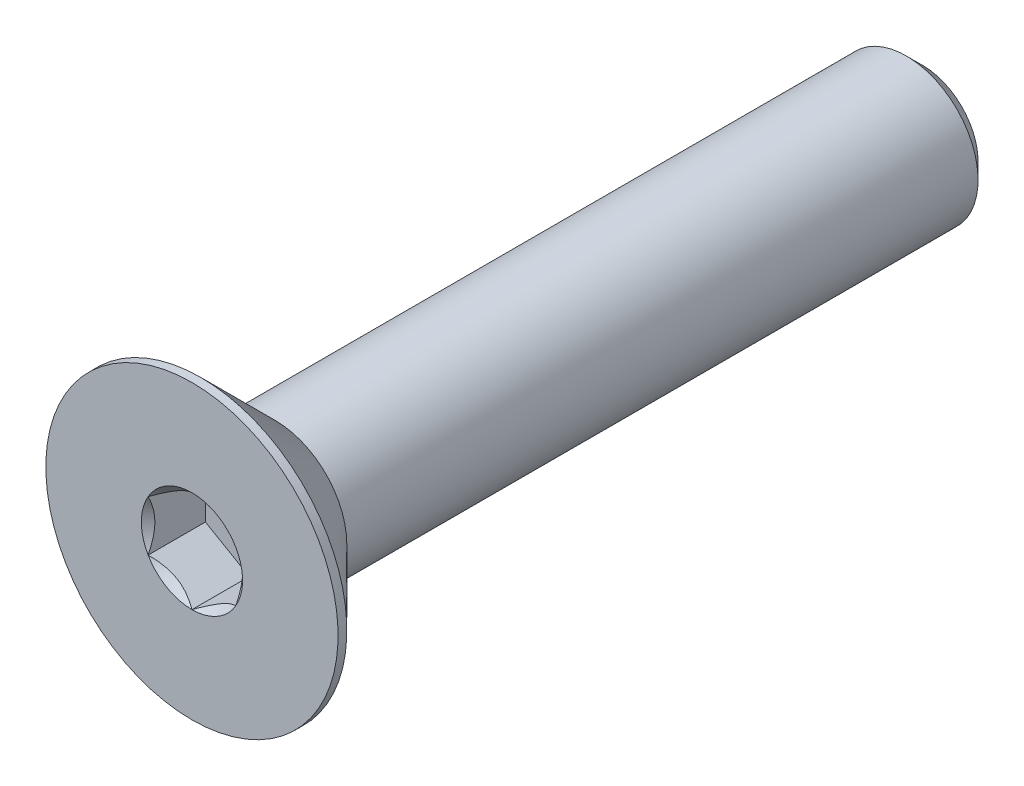
ISO-10303-21;
HEADER;
FILE_DESCRIPTION(('STEP AP214'),'2;1');
FILE_NAME('part.step','',(''),(''),'','','');
FILE_SCHEMA(('AUTOMOTIVE_DESIGN { 1 0 10303 214 1 1 1 1 }'));
ENDSEC;
DATA;
#1=APPLICATION_CONTEXT('core data for automotive mechanical design processes');
#2=APPLICATION_PROTOCOL_DEFINITION('international standard','automotive_design',2000,#1);
#3=PRODUCT_CONTEXT('',#1,'mechanical');
#4=PRODUCT('Part','Part','',(#3));
#5=PRODUCT_RELATED_PRODUCT_CATEGORY('part','',(#4));
#6=PRODUCT_DEFINITION_FORMATION('','',#4);
#7=PRODUCT_DEFINITION_CONTEXT('part definition',#1,'design');
#8=PRODUCT_DEFINITION('design','',#6,#7);
#9=PRODUCT_DEFINITION_SHAPE('','',#8);
#10=(LENGTH_UNIT() NAMED_UNIT(*) SI_UNIT(.MILLI.,.METRE.));
#11=(NAMED_UNIT(*) PLANE_ANGLE_UNIT() SI_UNIT($,.RADIAN.));
#12=(NAMED_UNIT(*) SI_UNIT($,.STERADIAN.) SOLID_ANGLE_UNIT());
#13=UNCERTAINTY_MEASURE_WITH_UNIT(LENGTH_MEASURE(1.E-05),#10,'distance_accuracy_value','');
#14=(GEOMETRIC_REPRESENTATION_CONTEXT(3) GLOBAL_UNCERTAINTY_ASSIGNED_CONTEXT((#13)) GLOBAL_UNIT_ASSIGNED_CONTEXT((#10,
#11,#12)) REPRESENTATION_CONTEXT('',''));
#15=CARTESIAN_POINT('',(0.,0.,0.));
#16=DIRECTION('',(0.,0.,1.));
#17=DIRECTION('',(1.,0.,0.));
#18=AXIS2_PLACEMENT_3D('',#15,#16,#17);
#19=CARTESIAN_POINT('',(0.,-1.73205080756888,-1.96));
#20=DIRECTION('',(0.5,-0.866025403784439,0.));
#21=DIRECTION('',(0.,0.,-1.));
#22=AXIS2_PLACEMENT_3D('',#19,#20,#21);
#23=PLANE('',#22);
#24=DIRECTION('',(0.,0.,1.));
#25=VECTOR('',#24,1.);
#26=CARTESIAN_POINT('',(0.,-1.73205080756888,-1.96));
#27=LINE('',#26,#25);
#28=CARTESIAN_POINT('',(0.,-1.73205080756888,-1.96));
#29=VERTEX_POINT('',#28);
#30=CARTESIAN_POINT('',(0.,-1.73205080756888,0.));
#31=VERTEX_POINT('',#30);
#32=EDGE_CURVE('E11',#29,#31,#27,.T.);
#33=ORIENTED_EDGE('',*,*,#32,.T.);
#34=CARTESIAN_POINT('',(0.,-1.73205080756888,0.));
#35=CARTESIAN_POINT('',(0.749999999999999,-1.29903810567666,-0.433012701892219));
#36=CARTESIAN_POINT('',(1.5,-0.86602540378444,0.));
#37=(BOUNDED_CURVE() B_SPLINE_CURVE(2,(#34,#35,#36),.UNSPECIFIED.,.F.,
.F.) B_SPLINE_CURVE_WITH_KNOTS((3,3),(-0.388312804292311,-0.130611113351457),
.UNSPECIFIED.) CURVE() GEOMETRIC_REPRESENTATION_ITEM() RATIONAL_B_SPLINE_CURVE((1.3094010767585,
1.51196612828742,1.3094010767585)) REPRESENTATION_ITEM(''));
#38=CARTESIAN_POINT('',(1.5,-0.86602540378444,0.));
#39=VERTEX_POINT('',#38);
#40=EDGE_CURVE('E112',#31,#39,#37,.T.);
#41=ORIENTED_EDGE('',*,*,#40,.T.);
#42=DIRECTION('',(0.,0.,1.));
#43=VECTOR('',#42,1.);
#44=CARTESIAN_POINT('',(1.5,-0.866025403784439,-1.96));
#45=LINE('',#44,#43);
#46=CARTESIAN_POINT('',(1.5,-0.866025403784439,-1.96));
#47=VERTEX_POINT('',#46);
#48=EDGE_CURVE('E181',#47,#39,#45,.T.);
#49=ORIENTED_EDGE('',*,*,#48,.F.);
#50=DIRECTION('',(0.866025403784439,0.5,0.));
#51=VECTOR('',#50,1.);
#52=CARTESIAN_POINT('',(0.,-1.73205080756888,-1.96));
#53=LINE('',#52,#51);
#54=EDGE_CURVE('E173',#29,#47,#53,.T.);
#55=ORIENTED_EDGE('',*,*,#54,.F.);
#56=EDGE_LOOP('',(#33,#41,#49,#55));
#57=FACE_BOUND('',#56,.T.);
#58=ADVANCED_FACE('F17',(#57),#23,.F.);
#59=CARTESIAN_POINT('',(-1.5,-0.866025403784438,-1.96));
#60=DIRECTION('',(-0.5,-0.866025403784439,0.));
#61=DIRECTION('',(-0.866025403784439,0.5,0.));
#62=AXIS2_PLACEMENT_3D('',#59,#60,#61);
#63=PLANE('',#62);
#64=DIRECTION('',(0.,0.,1.));
#65=VECTOR('',#64,1.);
#66=CARTESIAN_POINT('',(-1.5,-0.866025403784438,-1.96));
#67=LINE('',#66,#65);
#68=CARTESIAN_POINT('',(-1.5,-0.866025403784438,-1.96));
#69=VERTEX_POINT('',#68);
#70=CARTESIAN_POINT('',(-1.5,-0.866025403784438,0.));
#71=VERTEX_POINT('',#70);
#72=EDGE_CURVE('E27',#69,#71,#67,.T.);
#73=ORIENTED_EDGE('',*,*,#72,.T.);
#74=CARTESIAN_POINT('',(-1.5,-0.86602540378444,0.));
#75=CARTESIAN_POINT('',(-0.749999999999999,-1.29903810567666,-0.433012701892218));
#76=CARTESIAN_POINT('',(0.,-1.73205080756888,0.));
#77=(BOUNDED_CURVE() B_SPLINE_CURVE(2,(#74,#75,#76),.UNSPECIFIED.,.F.,
.F.) B_SPLINE_CURVE_WITH_KNOTS((3,3),(-0.388312804292311,-0.130611113351457),
.UNSPECIFIED.) CURVE() GEOMETRIC_REPRESENTATION_ITEM() RATIONAL_B_SPLINE_CURVE((1.3094010767585,
1.51196612828742,1.3094010767585)) REPRESENTATION_ITEM(''));
#78=EDGE_CURVE('E99',#71,#31,#77,.T.);
#79=ORIENTED_EDGE('',*,*,#78,.T.);
#80=ORIENTED_EDGE('',*,*,#32,.F.);
#81=DIRECTION('',(0.866025403784439,-0.5,0.));
#82=VECTOR('',#81,1.);
#83=CARTESIAN_POINT('',(-1.5,-0.866025403784438,-1.96));
#84=LINE('',#83,#82);
#85=EDGE_CURVE('E102',#69,#29,#84,.T.);
#86=ORIENTED_EDGE('',*,*,#85,.F.);
#87=EDGE_LOOP('',(#73,#79,#80,#86));
#88=FACE_BOUND('',#87,.T.);
#89=ADVANCED_FACE('F98',(#88),#63,.F.);
#90=CARTESIAN_POINT('',(-1.5,0.866025403784439,-1.96));
#91=DIRECTION('',(-1.,0.,0.));
#92=DIRECTION('',(0.,0.,1.));
#93=AXIS2_PLACEMENT_3D('',#90,#91,#92);
#94=PLANE('',#93);
#95=DIRECTION('',(0.,0.,1.));
#96=VECTOR('',#95,1.);
#97=CARTESIAN_POINT('',(-1.5,0.866025403784439,-1.96));
#98=LINE('',#97,#96);
#99=CARTESIAN_POINT('',(-1.5,0.866025403784439,-1.96));
#100=VERTEX_POINT('',#99);
#101=CARTESIAN_POINT('',(-1.5,0.86602540378444,0.));
#102=VERTEX_POINT('',#101);
#103=EDGE_CURVE('E52',#100,#102,#98,.T.);
#104=ORIENTED_EDGE('',*,*,#103,.T.);
#105=CARTESIAN_POINT('',(-1.5,0.866025403784437,0.));
#106=CARTESIAN_POINT('',(-1.5,0.,-0.433012701892218));
#107=CARTESIAN_POINT('',(-1.5,-0.866025403784438,0.));
#108=(BOUNDED_CURVE() B_SPLINE_CURVE(2,(#105,#106,#107),.UNSPECIFIED.,.F.,
.F.) B_SPLINE_CURVE_WITH_KNOTS((3,3),(-0.388312804292311,-0.130611113351457),
.UNSPECIFIED.) CURVE() GEOMETRIC_REPRESENTATION_ITEM() RATIONAL_B_SPLINE_CURVE((1.3094010767585,
1.51196612828742,1.3094010767585)) REPRESENTATION_ITEM(''));
#109=EDGE_CURVE('E113',#102,#71,#108,.T.);
#110=ORIENTED_EDGE('',*,*,#109,.T.);
#111=ORIENTED_EDGE('',*,*,#72,.F.);
#112=DIRECTION('',(0.,-1.,0.));
#113=VECTOR('',#112,1.);
#114=CARTESIAN_POINT('',(-1.5,0.866025403784439,-1.96));
#115=LINE('',#114,#113);
#116=EDGE_CURVE('E21',#100,#69,#115,.T.);
#117=ORIENTED_EDGE('',*,*,#116,.F.);
#118=EDGE_LOOP('',(#104,#110,#111,#117));
#119=FACE_BOUND('',#118,.T.);
#120=ADVANCED_FACE('F117',(#119),#94,.F.);
#121=CARTESIAN_POINT('',(0.,1.73205080756888,-1.96));
#122=DIRECTION('',(-0.5,0.866025403784439,0.));
#123=DIRECTION('',(0.,0.,1.));
#124=AXIS2_PLACEMENT_3D('',#121,#122,#123);
#125=PLANE('',#124);
#126=DIRECTION('',(0.,0.,1.));
#127=VECTOR('',#126,1.);
#128=CARTESIAN_POINT('',(0.,1.73205080756888,-1.96));
#129=LINE('',#128,#127);
#130=CARTESIAN_POINT('',(0.,1.73205080756888,-1.96));
#131=VERTEX_POINT('',#130);
#132=CARTESIAN_POINT('',(0.,1.73205080756888,0.));
#133=VERTEX_POINT('',#132);
#134=EDGE_CURVE('E180',#131,#133,#129,.T.);
#135=ORIENTED_EDGE('',*,*,#134,.T.);
#136=CARTESIAN_POINT('',(0.,1.73205080756888,0.));
#137=CARTESIAN_POINT('',(-0.75,1.29903810567666,-0.433012701892217));
#138=CARTESIAN_POINT('',(-1.5,0.86602540378444,0.));
#139=(BOUNDED_CURVE() B_SPLINE_CURVE(2,(#136,#137,#138),.UNSPECIFIED.,.F.,
.F.) B_SPLINE_CURVE_WITH_KNOTS((3,3),(-0.388312804292311,-0.130611113351457),
.UNSPECIFIED.) CURVE() GEOMETRIC_REPRESENTATION_ITEM() RATIONAL_B_SPLINE_CURVE((1.3094010767585,
1.51196612828741,1.3094010767585)) REPRESENTATION_ITEM(''));
#140=EDGE_CURVE('E120',#133,#102,#139,.T.);
#141=ORIENTED_EDGE('',*,*,#140,.T.);
#142=ORIENTED_EDGE('',*,*,#103,.F.);
#143=DIRECTION('',(-0.866025403784439,-0.5,0.));
#144=VECTOR('',#143,1.);
#145=CARTESIAN_POINT('',(0.,1.73205080756888,-1.96));
#146=LINE('',#145,#144);
#147=EDGE_CURVE('E161',#131,#100,#146,.T.);
#148=ORIENTED_EDGE('',*,*,#147,.F.);
#149=EDGE_LOOP('',(#135,#141,#142,#148));
#150=FACE_BOUND('',#149,.T.);
#151=ADVANCED_FACE('F348',(#150),#125,.F.);
#152=CARTESIAN_POINT('',(1.5,0.866025403784439,-1.96));
#153=DIRECTION('',(0.5,0.866025403784439,0.));
#154=DIRECTION('',(0.,0.,-1.));
#155=AXIS2_PLACEMENT_3D('',#152,#153,#154);
#156=PLANE('',#155);
#157=DIRECTION('',(0.,0.,1.));
#158=VECTOR('',#157,1.);
#159=CARTESIAN_POINT('',(1.5,0.866025403784439,-1.96));
#160=LINE('',#159,#158);
#161=CARTESIAN_POINT('',(1.5,0.866025403784439,-1.96));
#162=VERTEX_POINT('',#161);
#163=CARTESIAN_POINT('',(1.5,0.866025403784439,0.));
#164=VERTEX_POINT('',#163);
#165=EDGE_CURVE('E177',#162,#164,#160,.T.);
#166=ORIENTED_EDGE('',*,*,#165,.T.);
#167=CARTESIAN_POINT('',(1.5,0.86602540378444,0.));
#168=CARTESIAN_POINT('',(0.749999999999999,1.29903810567666,-0.433012701892218));
#169=CARTESIAN_POINT('',(0.,1.73205080756888,0.));
#170=(BOUNDED_CURVE() B_SPLINE_CURVE(2,(#167,#168,#169),.UNSPECIFIED.,.F.,
.F.) B_SPLINE_CURVE_WITH_KNOTS((3,3),(-0.388312804292311,-0.130611113351457),
.UNSPECIFIED.) CURVE() GEOMETRIC_REPRESENTATION_ITEM() RATIONAL_B_SPLINE_CURVE((1.3094010767585,
1.51196612828742,1.3094010767585)) REPRESENTATION_ITEM(''));
#171=EDGE_CURVE('E192',#164,#133,#170,.T.);
#172=ORIENTED_EDGE('',*,*,#171,.T.);
#173=ORIENTED_EDGE('',*,*,#134,.F.);
#174=DIRECTION('',(-0.866025403784439,0.5,0.));
#175=VECTOR('',#174,1.);
#176=CARTESIAN_POINT('',(1.5,0.866025403784439,-1.96));
#177=LINE('',#176,#175);
#178=EDGE_CURVE('E157',#162,#131,#177,.T.);
#179=ORIENTED_EDGE('',*,*,#178,.F.);
#180=EDGE_LOOP('',(#166,#172,#173,#179));
#181=FACE_BOUND('',#180,.T.);
#182=ADVANCED_FACE('F350',(#181),#156,.F.);
#183=CARTESIAN_POINT('',(1.5,-0.866025403784439,-1.96));
#184=DIRECTION('',(1.,0.,0.));
#185=DIRECTION('',(0.,-1.,0.));
#186=AXIS2_PLACEMENT_3D('',#183,#184,#185);
#187=PLANE('',#186);
#188=ORIENTED_EDGE('',*,*,#48,.T.);
#189=CARTESIAN_POINT('',(1.5,-0.866025403784438,0.));
#190=CARTESIAN_POINT('',(1.5,0.,-0.433012701892218));
#191=CARTESIAN_POINT('',(1.5,0.86602540378444,0.));
#192=(BOUNDED_CURVE() B_SPLINE_CURVE(2,(#189,#190,#191),.UNSPECIFIED.,.F.,
.F.) B_SPLINE_CURVE_WITH_KNOTS((3,3),(-0.388312804292311,-0.130611113351457),
.UNSPECIFIED.) CURVE() GEOMETRIC_REPRESENTATION_ITEM() RATIONAL_B_SPLINE_CURVE((1.3094010767585,
1.51196612828742,1.3094010767585)) REPRESENTATION_ITEM(''));
#193=EDGE_CURVE('E169',#39,#164,#192,.T.);
#194=ORIENTED_EDGE('',*,*,#193,.T.);
#195=ORIENTED_EDGE('',*,*,#165,.F.);
#196=DIRECTION('',(0.,1.,0.));
#197=VECTOR('',#196,1.);
#198=CARTESIAN_POINT('',(1.5,-0.866025403784439,-1.96));
#199=LINE('',#198,#197);
#200=EDGE_CURVE('E162',#47,#162,#199,.T.);
#201=ORIENTED_EDGE('',*,*,#200,.F.);
#202=EDGE_LOOP('',(#188,#194,#195,#201));
#203=FACE_BOUND('',#202,.T.);
#204=ADVANCED_FACE('F362',(#203),#187,.F.);
#205=CARTESIAN_POINT('',(1.5,-0.866025403784438,-1.96));
#206=DIRECTION('',(0.,0.,1.));
#207=DIRECTION('',(1.,0.,0.));
#208=AXIS2_PLACEMENT_3D('',#205,#206,#207);
#209=PLANE('',#208);
#210=ORIENTED_EDGE('',*,*,#54,.T.);
#211=ORIENTED_EDGE('',*,*,#200,.T.);
#212=ORIENTED_EDGE('',*,*,#178,.T.);
#213=ORIENTED_EDGE('',*,*,#147,.T.);
#214=ORIENTED_EDGE('',*,*,#116,.T.);
#215=ORIENTED_EDGE('',*,*,#85,.T.);
#216=EDGE_LOOP('',(#210,#211,#212,#213,#214,#215));
#217=FACE_BOUND('',#216,.T.);
#218=ADVANCED_FACE('F338',(#217),#209,.T.);
#219=CARTESIAN_POINT('',(0.,0.,0.));
#220=DIRECTION('',(0.,0.,1.));
#221=DIRECTION('',(1.,0.,0.));
#222=AXIS2_PLACEMENT_3D('',#219,#220,#221);
#223=CONICAL_SURFACE('',#222,1.73205080756888,0.78539816339745);
#224=CARTESIAN_POINT('',(0.,0.,0.));
#225=DIRECTION('',(0.,0.,1.));
#226=DIRECTION('',(1.,0.,0.));
#227=AXIS2_PLACEMENT_3D('',#224,#225,#226);
#228=CIRCLE('',#227,1.73205080756888);
#229=EDGE_CURVE('E134',#31,#39,#228,.T.);
#230=ORIENTED_EDGE('',*,*,#229,.T.);
#231=ORIENTED_EDGE('',*,*,#40,.F.);
#232=EDGE_LOOP('',(#230,#231));
#233=FACE_BOUND('',#232,.T.);
#234=ADVANCED_FACE('F255',(#233),#223,.F.);
#235=CARTESIAN_POINT('',(0.,0.,0.));
#236=DIRECTION('',(0.,0.,1.));
#237=DIRECTION('',(1.,0.,0.));
#238=AXIS2_PLACEMENT_3D('',#235,#236,#237);
#239=CONICAL_SURFACE('',#238,1.73205080756888,0.78539816339745);
#240=CARTESIAN_POINT('',(0.,0.,0.));
#241=DIRECTION('',(0.,0.,1.));
#242=DIRECTION('',(1.,0.,0.));
#243=AXIS2_PLACEMENT_3D('',#240,#241,#242);
#244=CIRCLE('',#243,1.73205080756888);
#245=EDGE_CURVE('E109',#71,#31,#244,.T.);
#246=ORIENTED_EDGE('',*,*,#245,.T.);
#247=ORIENTED_EDGE('',*,*,#78,.F.);
#248=EDGE_LOOP('',(#246,#247));
#249=FACE_BOUND('',#248,.T.);
#250=ADVANCED_FACE('F107',(#249),#239,.F.);
#251=CARTESIAN_POINT('',(0.,0.,0.));
#252=DIRECTION('',(0.,0.,1.));
#253=DIRECTION('',(-1.,0.,0.));
#254=AXIS2_PLACEMENT_3D('',#251,#252,#253);
#255=CONICAL_SURFACE('',#254,1.73205080756888,0.78539816339745);
#256=CARTESIAN_POINT('',(0.,0.,0.));
#257=DIRECTION('',(0.,0.,1.));
#258=DIRECTION('',(1.,0.,0.));
#259=AXIS2_PLACEMENT_3D('',#256,#257,#258);
#260=CIRCLE('',#259,1.73205080756888);
#261=EDGE_CURVE('E123',#102,#71,#260,.T.);
#262=ORIENTED_EDGE('',*,*,#261,.T.);
#263=ORIENTED_EDGE('',*,*,#109,.F.);
#264=EDGE_LOOP('',(#262,#263));
#265=FACE_BOUND('',#264,.T.);
#266=ADVANCED_FACE('F124',(#265),#255,.F.);
#267=CARTESIAN_POINT('',(0.,0.,0.));
#268=DIRECTION('',(0.,0.,1.));
#269=DIRECTION('',(1.,0.,0.));
#270=AXIS2_PLACEMENT_3D('',#267,#268,#269);
#271=CONICAL_SURFACE('',#270,1.73205080756888,0.78539816339745);
#272=CARTESIAN_POINT('',(0.,0.,0.));
#273=DIRECTION('',(0.,0.,1.));
#274=DIRECTION('',(1.,0.,0.));
#275=AXIS2_PLACEMENT_3D('',#272,#273,#274);
#276=CIRCLE('',#275,1.73205080756888);
#277=EDGE_CURVE('E128',#133,#102,#276,.T.);
#278=ORIENTED_EDGE('',*,*,#277,.T.);
#279=ORIENTED_EDGE('',*,*,#140,.F.);
#280=EDGE_LOOP('',(#278,#279));
#281=FACE_BOUND('',#280,.T.);
#282=ADVANCED_FACE('F320',(#281),#271,.F.);
#283=CARTESIAN_POINT('',(0.,0.,0.));
#284=DIRECTION('',(0.,0.,1.));
#285=DIRECTION('',(1.,0.,0.));
#286=AXIS2_PLACEMENT_3D('',#283,#284,#285);
#287=CONICAL_SURFACE('',#286,1.73205080756888,0.78539816339745);
#288=CARTESIAN_POINT('',(0.,0.,0.));
#289=DIRECTION('',(0.,0.,1.));
#290=DIRECTION('',(1.,0.,0.));
#291=AXIS2_PLACEMENT_3D('',#288,#289,#290);
#292=CIRCLE('',#291,1.73205080756888);
#293=EDGE_CURVE('E188',#164,#133,#292,.T.);
#294=ORIENTED_EDGE('',*,*,#293,.T.);
#295=ORIENTED_EDGE('',*,*,#171,.F.);
#296=EDGE_LOOP('',(#294,#295));
#297=FACE_BOUND('',#296,.T.);
#298=ADVANCED_FACE('F312',(#297),#287,.F.);
#299=CARTESIAN_POINT('',(0.,-2.5,0.));
#300=DIRECTION('',(0.,0.,1.));
#301=DIRECTION('',(0.,-1.,0.));
#302=AXIS2_PLACEMENT_3D('',#299,#300,#301);
#303=PLANE('',#302);
#304=ORIENTED_EDGE('',*,*,#229,.F.);
#305=ORIENTED_EDGE('',*,*,#245,.F.);
#306=ORIENTED_EDGE('',*,*,#261,.F.);
#307=ORIENTED_EDGE('',*,*,#277,.F.);
#308=ORIENTED_EDGE('',*,*,#293,.F.);
#309=CARTESIAN_POINT('',(0.,0.,0.));
#310=DIRECTION('',(0.,0.,1.));
#311=DIRECTION('',(1.,0.,0.));
#312=AXIS2_PLACEMENT_3D('',#309,#310,#311);
#313=CIRCLE('',#312,1.73205080756888);
#314=EDGE_CURVE('E218',#39,#164,#313,.T.);
#315=ORIENTED_EDGE('',*,*,#314,.F.);
#316=EDGE_LOOP('',(#304,#305,#306,#307,#308,#315));
#317=FACE_BOUND('',#316,.T.);
#318=CARTESIAN_POINT('',(0.,0.,0.));
#319=DIRECTION('',(0.,0.,1.));
#320=DIRECTION('',(0.,-1.,0.));
#321=AXIS2_PLACEMENT_3D('',#318,#319,#320);
#322=CIRCLE('',#321,5.);
#323=CARTESIAN_POINT('',(0.,5.,0.));
#324=VERTEX_POINT('',#323);
#325=EDGE_CURVE('E221',#324,#324,#322,.T.);
#326=ORIENTED_EDGE('',*,*,#325,.T.);
#327=EDGE_LOOP('',(#326));
#328=FACE_BOUND('',#327,.T.);
#329=ADVANCED_FACE('F130',(#317,#328),#303,.T.);
#330=CARTESIAN_POINT('',(0.,-2.5,-25.));
#331=DIRECTION('',(0.,0.,-1.));
#332=DIRECTION('',(0.,-1.,0.));
#333=AXIS2_PLACEMENT_3D('',#330,#331,#332);
#334=PLANE('',#333);
#335=CARTESIAN_POINT('',(0.,0.,-25.));
#336=DIRECTION('',(0.,0.,-1.));
#337=DIRECTION('',(1.,0.,0.));
#338=AXIS2_PLACEMENT_3D('',#335,#336,#337);
#339=CIRCLE('',#338,1.9);
#340=CARTESIAN_POINT('',(-1.9,0.,-25.));
#341=VERTEX_POINT('',#340);
#342=EDGE_CURVE('E217',#341,#341,#339,.T.);
#343=ORIENTED_EDGE('',*,*,#342,.T.);
#344=EDGE_LOOP('',(#343));
#345=FACE_BOUND('',#344,.T.);
#346=ADVANCED_FACE('F282',(#345),#334,.T.);
#347=CARTESIAN_POINT('',(0.,0.,-25.));
#348=DIRECTION('',(0.,0.,-1.));
#349=DIRECTION('',(0.,1.,0.));
#350=AXIS2_PLACEMENT_3D('',#347,#348,#349);
#351=CYLINDRICAL_SURFACE('',#350,2.4505);
#352=CARTESIAN_POINT('',(0.,0.,-24.4495));
#353=DIRECTION('',(0.,0.,1.));
#354=DIRECTION('',(0.,1.,0.));
#355=AXIS2_PLACEMENT_3D('',#352,#353,#354);
#356=CIRCLE('',#355,2.4505);
#357=CARTESIAN_POINT('',(0.,-2.4505,-24.4495));
#358=VERTEX_POINT('',#357);
#359=CARTESIAN_POINT('',(-2.4505,0.,-24.4495));
#360=VERTEX_POINT('',#359);
#361=EDGE_CURVE('E146',#358,#360,#356,.T.);
#362=ORIENTED_EDGE('',*,*,#361,.T.);
#363=CARTESIAN_POINT('',(0.,0.,-24.4495));
#364=DIRECTION('',(0.,0.,1.));
#365=DIRECTION('',(0.,1.,0.));
#366=AXIS2_PLACEMENT_3D('',#363,#364,#365);
#367=CIRCLE('',#366,2.4505);
#368=EDGE_CURVE('E148',#360,#358,#367,.T.);
#369=ORIENTED_EDGE('',*,*,#368,.T.);
#370=DIRECTION('',(0.,0.,1.));
#371=VECTOR('',#370,1.);
#372=CARTESIAN_POINT('',(0.,-2.4505,-25.));
#373=LINE('',#372,#371);
#374=CARTESIAN_POINT('',(0.,-2.4505,-2.8495));
#375=VERTEX_POINT('',#374);
#376=EDGE_CURVE('E140',#358,#375,#373,.T.);
#377=ORIENTED_EDGE('',*,*,#376,.T.);
#378=CARTESIAN_POINT('',(0.,0.,-2.8495));
#379=DIRECTION('',(0.,0.,1.));
#380=DIRECTION('',(0.,1.,0.));
#381=AXIS2_PLACEMENT_3D('',#378,#379,#380);
#382=CIRCLE('',#381,2.4505);
#383=CARTESIAN_POINT('',(0.,2.4505,-2.8495));
#384=VERTEX_POINT('',#383);
#385=EDGE_CURVE('E155',#384,#375,#382,.T.);
#386=ORIENTED_EDGE('',*,*,#385,.F.);
#387=CARTESIAN_POINT('',(0.,0.,-2.8495));
#388=DIRECTION('',(0.,0.,1.));
#389=DIRECTION('',(0.,1.,0.));
#390=AXIS2_PLACEMENT_3D('',#387,#388,#389);
#391=CIRCLE('',#390,2.4505);
#392=EDGE_CURVE('E166',#375,#384,#391,.T.);
#393=ORIENTED_EDGE('',*,*,#392,.F.);
#394=ORIENTED_EDGE('',*,*,#376,.F.);
#395=EDGE_LOOP('',(#362,#369,#377,#386,#393,#394));
#396=FACE_BOUND('',#395,.T.);
#397=ADVANCED_FACE('F291',(#396),#351,.T.);
#398=CARTESIAN_POINT('',(0.,0.,0.));
#399=DIRECTION('',(0.,0.,1.));
#400=DIRECTION('',(0.,-1.,0.));
#401=AXIS2_PLACEMENT_3D('',#398,#399,#400);
#402=CYLINDRICAL_SURFACE('',#401,5.);
#403=ORIENTED_EDGE('',*,*,#325,.F.);
#404=DIRECTION('',(0.,0.,-1.));
#405=VECTOR('',#404,1.);
#406=CARTESIAN_POINT('',(0.,5.,0.));
#407=LINE('',#406,#405);
#408=CARTESIAN_POINT('',(0.,5.,-0.300000000000012));
#409=VERTEX_POINT('',#408);
#410=EDGE_CURVE('E237',#324,#409,#407,.T.);
#411=ORIENTED_EDGE('',*,*,#410,.T.);
#412=CARTESIAN_POINT('',(0.,0.,-0.300000000000008));
#413=DIRECTION('',(0.,0.,1.));
#414=DIRECTION('',(0.,-1.,0.));
#415=AXIS2_PLACEMENT_3D('',#412,#413,#414);
#416=CIRCLE('',#415,5.);
#417=EDGE_CURVE('E156',#409,#409,#416,.T.);
#418=ORIENTED_EDGE('',*,*,#417,.T.);
#419=ORIENTED_EDGE('',*,*,#410,.F.);
#420=EDGE_LOOP('',(#403,#411,#418,#419));
#421=FACE_BOUND('',#420,.T.);
#422=ADVANCED_FACE('F308',(#421),#402,.T.);
#423=CARTESIAN_POINT('',(0.,0.,0.));
#424=DIRECTION('',(0.,0.,1.));
#425=DIRECTION('',(1.,0.,0.));
#426=AXIS2_PLACEMENT_3D('',#423,#424,#425);
#427=CONICAL_SURFACE('',#426,1.73205080756888,0.78539816339745);
#428=ORIENTED_EDGE('',*,*,#193,.F.);
#429=ORIENTED_EDGE('',*,*,#314,.T.);
#430=EDGE_LOOP('',(#428,#429));
#431=FACE_BOUND('',#430,.T.);
#432=ADVANCED_FACE('F260',(#431),#427,.F.);
#433=CARTESIAN_POINT('',(0.,0.,-2.8));
#434=DIRECTION('',(0.,0.,1.));
#435=DIRECTION('',(0.,-1.,0.));
#436=AXIS2_PLACEMENT_3D('',#433,#434,#435);
#437=CONICAL_SURFACE('',#436,2.5,0.78539816339745);
#438=ORIENTED_EDGE('',*,*,#417,.F.);
#439=DIRECTION('',(0.,-0.707106781186549,-0.707106781186546));
#440=VECTOR('',#439,1.);
#441=CARTESIAN_POINT('',(0.,2.5,-2.8));
#442=LINE('',#441,#440);
#443=EDGE_CURVE('E151',#409,#384,#442,.T.);
#444=ORIENTED_EDGE('',*,*,#443,.T.);
#445=ORIENTED_EDGE('',*,*,#385,.T.);
#446=ORIENTED_EDGE('',*,*,#392,.T.);
#447=ORIENTED_EDGE('',*,*,#443,.F.);
#448=EDGE_LOOP('',(#438,#444,#445,#446,#447));
#449=FACE_BOUND('',#448,.T.);
#450=ADVANCED_FACE('F342',(#449),#437,.T.);
#451=CARTESIAN_POINT('',(0.,0.,-24.7));
#452=DIRECTION('',(0.,0.,1.));
#453=DIRECTION('',(1.,0.,0.));
#454=AXIS2_PLACEMENT_3D('',#451,#452,#453);
#455=CONICAL_SURFACE('',#454,2.2,0.785398163397452);
#456=ORIENTED_EDGE('',*,*,#342,.F.);
#457=DIRECTION('',(-0.70710678118655,0.,0.707106781186545));
#458=VECTOR('',#457,1.);
#459=CARTESIAN_POINT('',(-2.2,0.,-24.7));
#460=LINE('',#459,#458);
#461=EDGE_CURVE('E149',#341,#360,#460,.T.);
#462=ORIENTED_EDGE('',*,*,#461,.T.);
#463=ORIENTED_EDGE('',*,*,#361,.F.);
#464=ORIENTED_EDGE('',*,*,#368,.F.);
#465=ORIENTED_EDGE('',*,*,#461,.F.);
#466=EDGE_LOOP('',(#456,#462,#463,#464,#465));
#467=FACE_BOUND('',#466,.T.);
#468=ADVANCED_FACE('F19',(#467),#455,.T.);
#469=CLOSED_SHELL('',(#58,#89,#120,#151,#182,#204,#218,#234,#250,#266,#282,#298,#329,#346,#397,
#422,#432,#450,#468));
#470=MANIFOLD_SOLID_BREP('B1',#469);
#471=ADVANCED_BREP_SHAPE_REPRESENTATION('',(#18,#470),#14);
#472=SHAPE_DEFINITION_REPRESENTATION(#9,#471);
ENDSEC;
END-ISO-10303-21;
